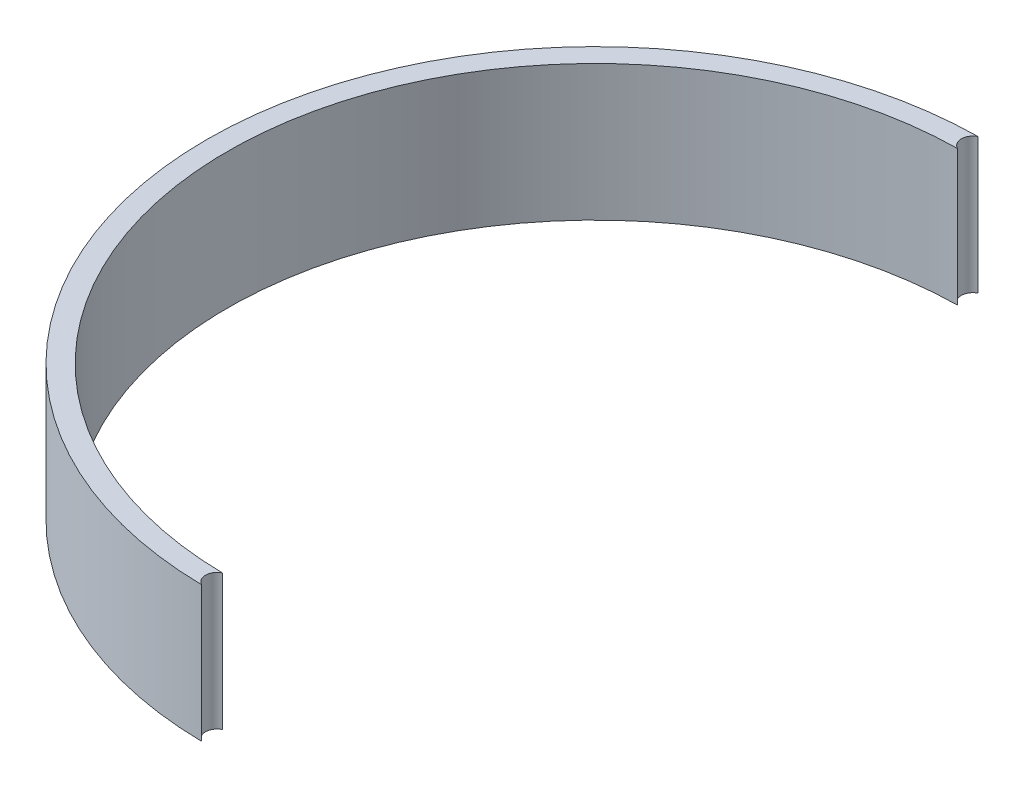
ISO-10303-21;
HEADER;
FILE_DESCRIPTION(('STEP AP214'),'2;1');
FILE_NAME('part.step','',(''),(''),'','','');
FILE_SCHEMA(('AUTOMOTIVE_DESIGN { 1 0 10303 214 1 1 1 1 }'));
ENDSEC;
DATA;
#1=APPLICATION_CONTEXT('core data for automotive mechanical design processes');
#2=APPLICATION_PROTOCOL_DEFINITION('international standard','automotive_design',2000,#1);
#3=PRODUCT_CONTEXT('',#1,'mechanical');
#4=PRODUCT('Part','Part','',(#3));
#5=PRODUCT_RELATED_PRODUCT_CATEGORY('part','',(#4));
#6=PRODUCT_DEFINITION_FORMATION('','',#4);
#7=PRODUCT_DEFINITION_CONTEXT('part definition',#1,'design');
#8=PRODUCT_DEFINITION('design','',#6,#7);
#9=PRODUCT_DEFINITION_SHAPE('','',#8);
#10=(LENGTH_UNIT() NAMED_UNIT(*) SI_UNIT(.MILLI.,.METRE.));
#11=(NAMED_UNIT(*) PLANE_ANGLE_UNIT() SI_UNIT($,.RADIAN.));
#12=(NAMED_UNIT(*) SI_UNIT($,.STERADIAN.) SOLID_ANGLE_UNIT());
#13=UNCERTAINTY_MEASURE_WITH_UNIT(LENGTH_MEASURE(1.E-05),#10,'distance_accuracy_value','');
#14=(GEOMETRIC_REPRESENTATION_CONTEXT(3) GLOBAL_UNCERTAINTY_ASSIGNED_CONTEXT((#13)) GLOBAL_UNIT_ASSIGNED_CONTEXT((#10,
#11,#12)) REPRESENTATION_CONTEXT('',''));
#15=CARTESIAN_POINT('',(0.,0.,0.));
#16=DIRECTION('',(0.,0.,1.));
#17=DIRECTION('',(1.,0.,0.));
#18=AXIS2_PLACEMENT_3D('',#15,#16,#17);
#19=CARTESIAN_POINT('',(0.,10.,27.8555));
#20=DIRECTION('',(0.,-1.,0.));
#21=DIRECTION('',(0.,0.,-1.));
#22=AXIS2_PLACEMENT_3D('',#19,#20,#21);
#23=CYLINDRICAL_SURFACE('',#22,0.85);
#24=CARTESIAN_POINT('',(0.,0.,27.8555));
#25=DIRECTION('',(0.,1.,0.));
#26=DIRECTION('',(0.,0.,1.));
#27=AXIS2_PLACEMENT_3D('',#24,#25,#26);
#28=CIRCLE('',#27,0.85);
#29=CARTESIAN_POINT('',(-0.374429978430776,0.,27.0924127236991));
#30=VERTEX_POINT('',#29);
#31=CARTESIAN_POINT('',(-0.384796443922002,0.,28.6134127236991));
#32=VERTEX_POINT('',#31);
#33=EDGE_CURVE('E115',#30,#32,#28,.T.);
#34=ORIENTED_EDGE('',*,*,#33,.F.);
#35=DIRECTION('',(0.,-1.,0.));
#36=VECTOR('',#35,1.);
#37=CARTESIAN_POINT('',(-0.374429978430776,10.,27.0924127236991));
#38=LINE('',#37,#36);
#39=CARTESIAN_POINT('',(-0.374429978430776,10.,27.0924127236991));
#40=VERTEX_POINT('',#39);
#41=EDGE_CURVE('E11',#40,#30,#38,.T.);
#42=ORIENTED_EDGE('',*,*,#41,.F.);
#43=CARTESIAN_POINT('',(0.,10.,27.8555));
#44=DIRECTION('',(0.,1.,0.));
#45=DIRECTION('',(0.,0.,1.));
#46=AXIS2_PLACEMENT_3D('',#43,#44,#45);
#47=CIRCLE('',#46,0.85);
#48=CARTESIAN_POINT('',(-0.384796443922002,10.,28.6134127236991));
#49=VERTEX_POINT('',#48);
#50=EDGE_CURVE('E105',#40,#49,#47,.T.);
#51=ORIENTED_EDGE('',*,*,#50,.T.);
#52=DIRECTION('',(0.,-1.,0.));
#53=VECTOR('',#52,1.);
#54=CARTESIAN_POINT('',(-0.384796443922002,10.,28.6134127236991));
#55=LINE('',#54,#53);
#56=EDGE_CURVE('E46',#49,#32,#55,.T.);
#57=ORIENTED_EDGE('',*,*,#56,.T.);
#58=EDGE_LOOP('',(#34,#42,#51,#57));
#59=FACE_BOUND('',#58,.T.);
#60=ADVANCED_FACE('F43',(#59),#23,.F.);
#61=CARTESIAN_POINT('',(0.,10.,0.));
#62=DIRECTION('',(0.,-1.,0.));
#63=DIRECTION('',(0.,0.,-1.));
#64=AXIS2_PLACEMENT_3D('',#61,#62,#63);
#65=CYLINDRICAL_SURFACE('',#64,27.095);
#66=CARTESIAN_POINT('',(0.,0.,0.));
#67=DIRECTION('',(0.,1.,0.));
#68=DIRECTION('',(0.,0.,1.));
#69=AXIS2_PLACEMENT_3D('',#66,#67,#68);
#70=CIRCLE('',#69,27.095);
#71=CARTESIAN_POINT('',(-0.374429978430757,0.,-27.0924127236991));
#72=VERTEX_POINT('',#71);
#73=EDGE_CURVE('E110',#72,#30,#70,.T.);
#74=ORIENTED_EDGE('',*,*,#73,.F.);
#75=DIRECTION('',(0.,-1.,0.));
#76=VECTOR('',#75,1.);
#77=CARTESIAN_POINT('',(-0.374429978430757,10.,-27.0924127236991));
#78=LINE('',#77,#76);
#79=CARTESIAN_POINT('',(-0.374429978430757,10.,-27.0924127236991));
#80=VERTEX_POINT('',#79);
#81=EDGE_CURVE('E53',#80,#72,#78,.T.);
#82=ORIENTED_EDGE('',*,*,#81,.F.);
#83=CARTESIAN_POINT('',(0.,10.,0.));
#84=DIRECTION('',(0.,1.,0.));
#85=DIRECTION('',(0.,0.,1.));
#86=AXIS2_PLACEMENT_3D('',#83,#84,#85);
#87=CIRCLE('',#86,27.095);
#88=EDGE_CURVE('E100',#80,#40,#87,.T.);
#89=ORIENTED_EDGE('',*,*,#88,.T.);
#90=ORIENTED_EDGE('',*,*,#41,.T.);
#91=EDGE_LOOP('',(#74,#82,#89,#90));
#92=FACE_BOUND('',#91,.T.);
#93=ADVANCED_FACE('F129',(#92),#65,.F.);
#94=CARTESIAN_POINT('',(0.,10.,-27.8555));
#95=DIRECTION('',(0.,-1.,0.));
#96=DIRECTION('',(0.,0.,-1.));
#97=AXIS2_PLACEMENT_3D('',#94,#95,#96);
#98=CYLINDRICAL_SURFACE('',#97,0.85);
#99=CARTESIAN_POINT('',(0.,0.,-27.8555));
#100=DIRECTION('',(0.,1.,0.));
#101=DIRECTION('',(0.,0.,1.));
#102=AXIS2_PLACEMENT_3D('',#99,#100,#101);
#103=CIRCLE('',#102,0.85);
#104=CARTESIAN_POINT('',(-0.384796443922025,0.,-28.6134127236991));
#105=VERTEX_POINT('',#104);
#106=EDGE_CURVE('E94',#105,#72,#103,.T.);
#107=ORIENTED_EDGE('',*,*,#106,.F.);
#108=DIRECTION('',(0.,-1.,0.));
#109=VECTOR('',#108,1.);
#110=CARTESIAN_POINT('',(-0.384796443922025,10.,-28.6134127236991));
#111=LINE('',#110,#109);
#112=CARTESIAN_POINT('',(-0.384796443922025,10.,-28.6134127236991));
#113=VERTEX_POINT('',#112);
#114=EDGE_CURVE('E89',#113,#105,#111,.T.);
#115=ORIENTED_EDGE('',*,*,#114,.F.);
#116=CARTESIAN_POINT('',(0.,10.,-27.8555));
#117=DIRECTION('',(0.,1.,0.));
#118=DIRECTION('',(0.,0.,1.));
#119=AXIS2_PLACEMENT_3D('',#116,#117,#118);
#120=CIRCLE('',#119,0.85);
#121=EDGE_CURVE('E92',#113,#80,#120,.T.);
#122=ORIENTED_EDGE('',*,*,#121,.T.);
#123=ORIENTED_EDGE('',*,*,#81,.T.);
#124=EDGE_LOOP('',(#107,#115,#122,#123));
#125=FACE_BOUND('',#124,.T.);
#126=ADVANCED_FACE('F91',(#125),#98,.F.);
#127=CARTESIAN_POINT('',(1.93313247354165E-13,10.,0.));
#128=DIRECTION('',(0.,-1.,0.));
#129=DIRECTION('',(0.,0.,-1.));
#130=AXIS2_PLACEMENT_3D('',#127,#128,#129);
#131=CYLINDRICAL_SURFACE('',#130,28.616);
#132=CARTESIAN_POINT('',(1.93313247354165E-13,0.,0.));
#133=DIRECTION('',(0.,-1.,0.));
#134=DIRECTION('',(0.,0.,-1.));
#135=AXIS2_PLACEMENT_3D('',#132,#133,#134);
#136=CIRCLE('',#135,28.616);
#137=EDGE_CURVE('E119',#32,#105,#136,.T.);
#138=ORIENTED_EDGE('',*,*,#137,.F.);
#139=ORIENTED_EDGE('',*,*,#56,.F.);
#140=CARTESIAN_POINT('',(1.93313247354165E-13,10.,0.));
#141=DIRECTION('',(0.,-1.,0.));
#142=DIRECTION('',(0.,0.,-1.));
#143=AXIS2_PLACEMENT_3D('',#140,#141,#142);
#144=CIRCLE('',#143,28.616);
#145=EDGE_CURVE('E99',#49,#113,#144,.T.);
#146=ORIENTED_EDGE('',*,*,#145,.T.);
#147=ORIENTED_EDGE('',*,*,#114,.T.);
#148=EDGE_LOOP('',(#138,#139,#146,#147));
#149=FACE_BOUND('',#148,.T.);
#150=ADVANCED_FACE('F103',(#149),#131,.T.);
#151=CARTESIAN_POINT('',(0.,10.,13.92775));
#152=DIRECTION('',(0.,1.,0.));
#153=DIRECTION('',(0.,0.,1.));
#154=AXIS2_PLACEMENT_3D('',#151,#152,#153);
#155=PLANE('',#154);
#156=ORIENTED_EDGE('',*,*,#50,.F.);
#157=ORIENTED_EDGE('',*,*,#88,.F.);
#158=ORIENTED_EDGE('',*,*,#121,.F.);
#159=ORIENTED_EDGE('',*,*,#145,.F.);
#160=EDGE_LOOP('',(#156,#157,#158,#159));
#161=FACE_BOUND('',#160,.T.);
#162=ADVANCED_FACE('F98',(#161),#155,.T.);
#163=CARTESIAN_POINT('',(0.,0.,13.92775));
#164=DIRECTION('',(0.,1.,0.));
#165=DIRECTION('',(0.,0.,1.));
#166=AXIS2_PLACEMENT_3D('',#163,#164,#165);
#167=PLANE('',#166);
#168=ORIENTED_EDGE('',*,*,#33,.T.);
#169=ORIENTED_EDGE('',*,*,#137,.T.);
#170=ORIENTED_EDGE('',*,*,#106,.T.);
#171=ORIENTED_EDGE('',*,*,#73,.T.);
#172=EDGE_LOOP('',(#168,#169,#170,#171));
#173=FACE_BOUND('',#172,.T.);
#174=ADVANCED_FACE('F128',(#173),#167,.F.);
#175=CLOSED_SHELL('',(#60,#93,#126,#150,#162,#174));
#176=MANIFOLD_SOLID_BREP('B2',#175);
#177=ADVANCED_BREP_SHAPE_REPRESENTATION('',(#18,#176),#14);
#178=SHAPE_DEFINITION_REPRESENTATION(#9,#177);
ENDSEC;
END-ISO-10303-21;
